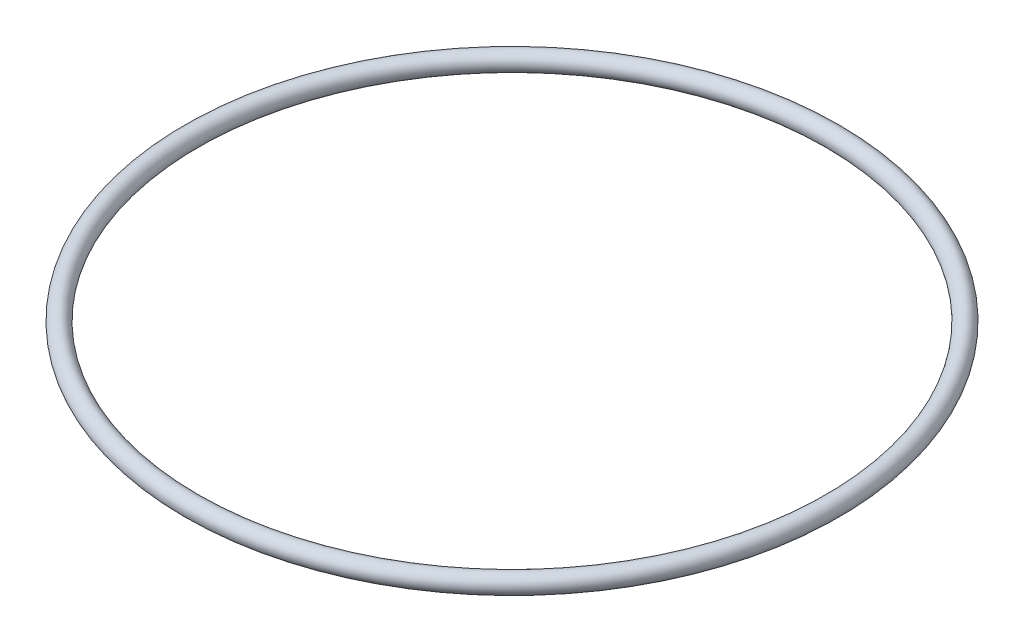
ISO-10303-21;
HEADER;
FILE_DESCRIPTION(('STEP AP214'),'2;1');
FILE_NAME('part.step','',(''),(''),'','','');
FILE_SCHEMA(('AUTOMOTIVE_DESIGN { 1 0 10303 214 1 1 1 1 }'));
ENDSEC;
DATA;
#1=APPLICATION_CONTEXT('core data for automotive mechanical design processes');
#2=APPLICATION_PROTOCOL_DEFINITION('international standard','automotive_design',2000,#1);
#3=PRODUCT_CONTEXT('',#1,'mechanical');
#4=PRODUCT('Part','Part','',(#3));
#5=PRODUCT_RELATED_PRODUCT_CATEGORY('part','',(#4));
#6=PRODUCT_DEFINITION_FORMATION('','',#4);
#7=PRODUCT_DEFINITION_CONTEXT('part definition',#1,'design');
#8=PRODUCT_DEFINITION('design','',#6,#7);
#9=PRODUCT_DEFINITION_SHAPE('','',#8);
#10=(LENGTH_UNIT() NAMED_UNIT(*) SI_UNIT(.MILLI.,.METRE.));
#11=(NAMED_UNIT(*) PLANE_ANGLE_UNIT() SI_UNIT($,.RADIAN.));
#12=(NAMED_UNIT(*) SI_UNIT($,.STERADIAN.) SOLID_ANGLE_UNIT());
#13=UNCERTAINTY_MEASURE_WITH_UNIT(LENGTH_MEASURE(1.E-05),#10,'distance_accuracy_value','');
#14=(GEOMETRIC_REPRESENTATION_CONTEXT(3) GLOBAL_UNCERTAINTY_ASSIGNED_CONTEXT((#13)) GLOBAL_UNIT_ASSIGNED_CONTEXT((#10,
#11,#12)) REPRESENTATION_CONTEXT('',''));
#15=CARTESIAN_POINT('',(0.,0.,0.));
#16=DIRECTION('',(0.,0.,1.));
#17=DIRECTION('',(1.,0.,0.));
#18=AXIS2_PLACEMENT_3D('',#15,#16,#17);
#19=CARTESIAN_POINT('',(0.,0.,0.));
#20=DIRECTION('',(0.,-1.,0.));
#21=DIRECTION('',(0.,0.,-1.));
#22=AXIS2_PLACEMENT_3D('',#19,#20,#21);
#23=TOROIDAL_SURFACE('',#22,43.4,1.25);
#24=CARTESIAN_POINT('',(0.,0.,-44.65));
#25=VERTEX_POINT('',#24);
#26=VERTEX_LOOP('',#25);
#27=FACE_BOUND('',#26,.T.);
#28=ADVANCED_FACE('F34',(#27),#23,.T.);
#29=CLOSED_SHELL('',(#28));
#30=MANIFOLD_SOLID_BREP('B2',#29);
#31=ADVANCED_BREP_SHAPE_REPRESENTATION('',(#18,#30),#14);
#32=SHAPE_DEFINITION_REPRESENTATION(#9,#31);
ENDSEC;
END-ISO-10303-21;
